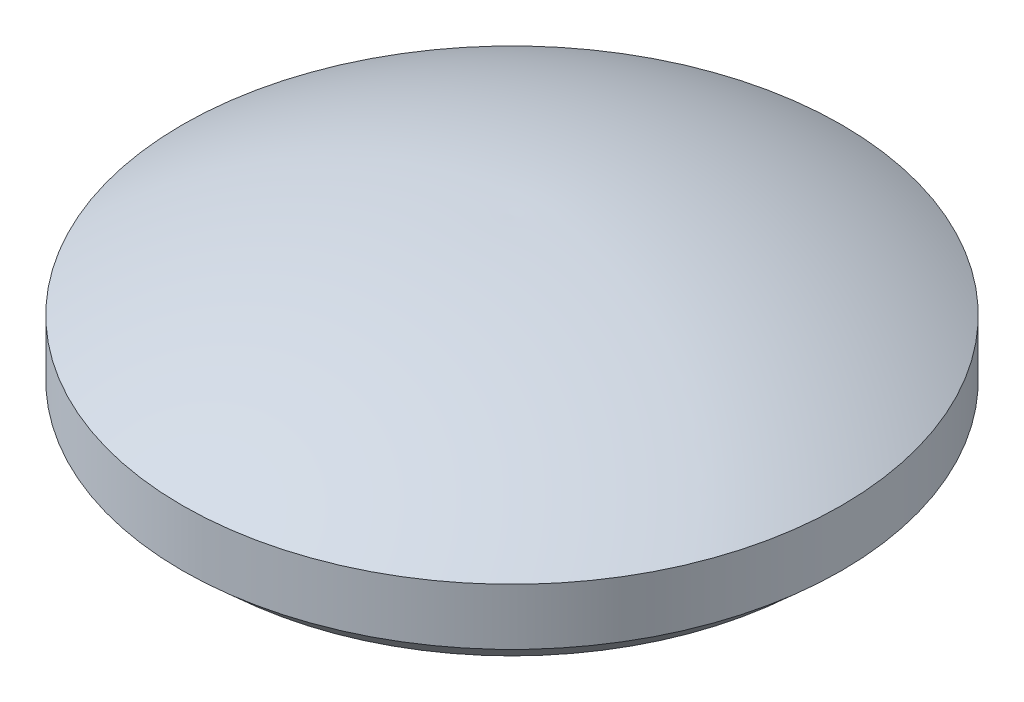
ISO-10303-21;
HEADER;
FILE_DESCRIPTION(('STEP AP214'),'2;1');
FILE_NAME('part.step','',(''),(''),'','','');
FILE_SCHEMA(('AUTOMOTIVE_DESIGN { 1 0 10303 214 1 1 1 1 }'));
ENDSEC;
DATA;
#1=APPLICATION_CONTEXT('core data for automotive mechanical design processes');
#2=APPLICATION_PROTOCOL_DEFINITION('international standard','automotive_design',2000,#1);
#3=PRODUCT_CONTEXT('',#1,'mechanical');
#4=PRODUCT('Part','Part','',(#3));
#5=PRODUCT_RELATED_PRODUCT_CATEGORY('part','',(#4));
#6=PRODUCT_DEFINITION_FORMATION('','',#4);
#7=PRODUCT_DEFINITION_CONTEXT('part definition',#1,'design');
#8=PRODUCT_DEFINITION('design','',#6,#7);
#9=PRODUCT_DEFINITION_SHAPE('','',#8);
#10=(LENGTH_UNIT() NAMED_UNIT(*) SI_UNIT(.MILLI.,.METRE.));
#11=(NAMED_UNIT(*) PLANE_ANGLE_UNIT() SI_UNIT($,.RADIAN.));
#12=(NAMED_UNIT(*) SI_UNIT($,.STERADIAN.) SOLID_ANGLE_UNIT());
#13=UNCERTAINTY_MEASURE_WITH_UNIT(LENGTH_MEASURE(1.E-05),#10,'distance_accuracy_value','');
#14=(GEOMETRIC_REPRESENTATION_CONTEXT(3) GLOBAL_UNCERTAINTY_ASSIGNED_CONTEXT((#13)) GLOBAL_UNIT_ASSIGNED_CONTEXT((#10,
#11,#12)) REPRESENTATION_CONTEXT('',''));
#15=CARTESIAN_POINT('',(0.,0.,0.));
#16=DIRECTION('',(0.,0.,1.));
#17=DIRECTION('',(1.,0.,0.));
#18=AXIS2_PLACEMENT_3D('',#15,#16,#17);
#19=CARTESIAN_POINT('',(0.,0.,0.));
#20=DIRECTION('',(0.,-1.,0.));
#21=DIRECTION('',(0.,0.,-1.));
#22=AXIS2_PLACEMENT_3D('',#19,#20,#21);
#23=PLANE('',#22);
#24=CARTESIAN_POINT('',(0.,0.,0.));
#25=DIRECTION('',(0.,-1.,0.));
#26=DIRECTION('',(0.,0.,-1.));
#27=AXIS2_PLACEMENT_3D('',#24,#25,#26);
#28=CIRCLE('',#27,22.5);
#29=CARTESIAN_POINT('',(0.,0.,-22.5));
#30=VERTEX_POINT('',#29);
#31=EDGE_CURVE('E61',#30,#30,#28,.T.);
#32=ORIENTED_EDGE('',*,*,#31,.T.);
#33=EDGE_LOOP('',(#32));
#34=FACE_BOUND('',#33,.T.);
#35=ADVANCED_FACE('F32',(#34),#23,.T.);
#36=CARTESIAN_POINT('',(0.,-78.9738587137538,-2.74372139111743));
#37=DIRECTION('',(-1.,0.,0.));
#38=DIRECTION('',(0.,0.,-1.));
#39=AXIS2_PLACEMENT_3D('',#36,#37,#38);
#40=CIRCLE('',#39,144.);
#41=TRIMMED_CURVE('',#40,(PARAMETER_VALUE(-1.58985110062748)),
(PARAMETER_VALUE(1.58985110062748)),.T.,.PARAMETER.);
#42=CARTESIAN_POINT('',(0.,-78.9738587137538,0.));
#43=DIRECTION('',(0.,-1.,0.));
#44=AXIS1_PLACEMENT('',#42,#43);
#45=SURFACE_OF_REVOLUTION('',#41,#44);
#46=CARTESIAN_POINT('',(0.,65.,0.));
#47=VERTEX_POINT('',#46);
#48=VERTEX_LOOP('',#47);
#49=FACE_BOUND('',#48,.T.);
#50=CARTESIAN_POINT('',(0.,45.,0.));
#51=DIRECTION('',(0.,-1.,0.));
#52=DIRECTION('',(0.,0.,-1.));
#53=AXIS2_PLACEMENT_3D('',#50,#51,#52);
#54=CIRCLE('',#53,76.);
#55=CARTESIAN_POINT('',(0.,45.,-76.));
#56=VERTEX_POINT('',#55);
#57=EDGE_CURVE('E11',#56,#56,#54,.T.);
#58=ORIENTED_EDGE('',*,*,#57,.F.);
#59=EDGE_LOOP('',(#58));
#60=FACE_BOUND('',#59,.T.);
#61=ADVANCED_FACE('F41',(#49,#60),#45,.T.);
#62=CARTESIAN_POINT('',(0.,0.,0.));
#63=DIRECTION('',(0.,-1.,0.));
#64=DIRECTION('',(0.,0.,-1.));
#65=AXIS2_PLACEMENT_3D('',#62,#63,#64);
#66=CYLINDRICAL_SURFACE('',#65,76.);
#67=ORIENTED_EDGE('',*,*,#57,.T.);
#68=EDGE_LOOP('',(#67));
#69=FACE_BOUND('',#68,.T.);
#70=CARTESIAN_POINT('',(0.,32.,0.));
#71=DIRECTION('',(0.,-1.,0.));
#72=DIRECTION('',(0.,0.,-1.));
#73=AXIS2_PLACEMENT_3D('',#70,#71,#72);
#74=CIRCLE('',#73,76.);
#75=CARTESIAN_POINT('',(0.,32.,-76.));
#76=VERTEX_POINT('',#75);
#77=EDGE_CURVE('E38',#76,#76,#74,.T.);
#78=ORIENTED_EDGE('',*,*,#77,.F.);
#79=EDGE_LOOP('',(#78));
#80=FACE_BOUND('',#79,.T.);
#81=ADVANCED_FACE('F44',(#69,#80),#66,.T.);
#82=CARTESIAN_POINT('',(0.,26.,0.));
#83=DIRECTION('',(0.,1.,0.));
#84=DIRECTION('',(0.,0.,1.));
#85=AXIS2_PLACEMENT_3D('',#82,#83,#84);
#86=CONICAL_SURFACE('',#85,69.34375,0.83720362018845);
#87=ORIENTED_EDGE('',*,*,#77,.T.);
#88=EDGE_LOOP('',(#87));
#89=FACE_BOUND('',#88,.T.);
#90=CARTESIAN_POINT('',(0.,26.,0.));
#91=DIRECTION('',(0.,-1.,0.));
#92=DIRECTION('',(0.,0.,-1.));
#93=AXIS2_PLACEMENT_3D('',#90,#91,#92);
#94=CIRCLE('',#93,69.34375);
#95=CARTESIAN_POINT('',(0.,26.,-69.34375));
#96=VERTEX_POINT('',#95);
#97=EDGE_CURVE('E54',#96,#96,#94,.T.);
#98=ORIENTED_EDGE('',*,*,#97,.F.);
#99=EDGE_LOOP('',(#98));
#100=FACE_BOUND('',#99,.T.);
#101=ADVANCED_FACE('F49',(#89,#100),#86,.T.);
#102=CARTESIAN_POINT('',(51.34375,26.,0.));
#103=DIRECTION('',(0.,-1.,0.));
#104=DIRECTION('',(0.,0.,-1.));
#105=AXIS2_PLACEMENT_3D('',#102,#103,#104);
#106=PLANE('',#105);
#107=ORIENTED_EDGE('',*,*,#97,.T.);
#108=EDGE_LOOP('',(#107));
#109=FACE_BOUND('',#108,.T.);
#110=CARTESIAN_POINT('',(0.,26.,0.));
#111=DIRECTION('',(0.,-1.,0.));
#112=DIRECTION('',(0.,0.,-1.));
#113=AXIS2_PLACEMENT_3D('',#110,#111,#112);
#114=CIRCLE('',#113,51.34375);
#115=CARTESIAN_POINT('',(0.,26.,-51.34375));
#116=VERTEX_POINT('',#115);
#117=EDGE_CURVE('E56',#116,#116,#114,.T.);
#118=ORIENTED_EDGE('',*,*,#117,.F.);
#119=EDGE_LOOP('',(#118));
#120=FACE_BOUND('',#119,.T.);
#121=ADVANCED_FACE('F68',(#109,#120),#106,.T.);
#122=CARTESIAN_POINT('',(0.,0.,0.));
#123=DIRECTION('',(0.,1.,0.));
#124=DIRECTION('',(0.,0.,1.));
#125=AXIS2_PLACEMENT_3D('',#122,#123,#124);
#126=CONICAL_SURFACE('',#125,22.5,0.837203620188449);
#127=ORIENTED_EDGE('',*,*,#117,.T.);
#128=EDGE_LOOP('',(#127));
#129=FACE_BOUND('',#128,.T.);
#130=ORIENTED_EDGE('',*,*,#31,.F.);
#131=EDGE_LOOP('',(#130));
#132=FACE_BOUND('',#131,.T.);
#133=ADVANCED_FACE('F66',(#129,#132),#126,.T.);
#134=CLOSED_SHELL('',(#35,#61,#81,#101,#121,#133));
#135=MANIFOLD_SOLID_BREP('B2',#134);
#136=ADVANCED_BREP_SHAPE_REPRESENTATION('',(#18,#135),#14);
#137=SHAPE_DEFINITION_REPRESENTATION(#9,#136);
ENDSEC;
END-ISO-10303-21;
